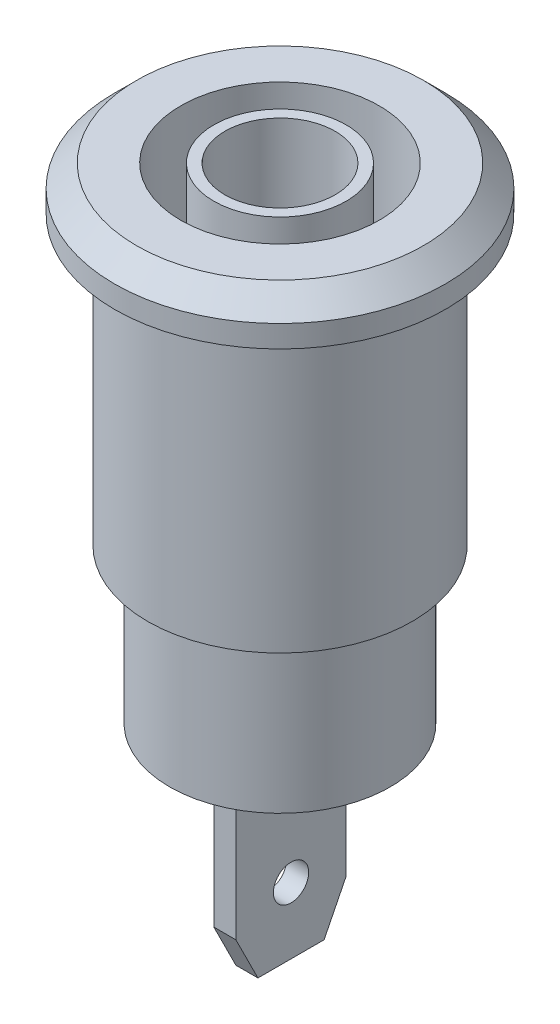
ISO-10303-21;
HEADER;
FILE_DESCRIPTION(('STEP AP214'),'2;1');
FILE_NAME('part.step','',(''),(''),'','','');
FILE_SCHEMA(('AUTOMOTIVE_DESIGN { 1 0 10303 214 1 1 1 1 }'));
ENDSEC;
DATA;
#1=APPLICATION_CONTEXT('core data for automotive mechanical design processes');
#2=APPLICATION_PROTOCOL_DEFINITION('international standard','automotive_design',2000,#1);
#3=PRODUCT_CONTEXT('',#1,'mechanical');
#4=PRODUCT('Part','Part','',(#3));
#5=PRODUCT_RELATED_PRODUCT_CATEGORY('part','',(#4));
#6=PRODUCT_DEFINITION_FORMATION('','',#4);
#7=PRODUCT_DEFINITION_CONTEXT('part definition',#1,'design');
#8=PRODUCT_DEFINITION('design','',#6,#7);
#9=PRODUCT_DEFINITION_SHAPE('','',#8);
#10=(LENGTH_UNIT() NAMED_UNIT(*) SI_UNIT(.MILLI.,.METRE.));
#11=(NAMED_UNIT(*) PLANE_ANGLE_UNIT() SI_UNIT($,.RADIAN.));
#12=(NAMED_UNIT(*) SI_UNIT($,.STERADIAN.) SOLID_ANGLE_UNIT());
#13=UNCERTAINTY_MEASURE_WITH_UNIT(LENGTH_MEASURE(1.E-05),#10,'distance_accuracy_value','');
#14=(GEOMETRIC_REPRESENTATION_CONTEXT(3) GLOBAL_UNCERTAINTY_ASSIGNED_CONTEXT((#13)) GLOBAL_UNIT_ASSIGNED_CONTEXT((#10,
#11,#12)) REPRESENTATION_CONTEXT('',''));
#15=CARTESIAN_POINT('',(0.,0.,0.));
#16=DIRECTION('',(0.,0.,1.));
#17=DIRECTION('',(1.,0.,0.));
#18=AXIS2_PLACEMENT_3D('',#15,#16,#17);
#19=CARTESIAN_POINT('',(0.,-22.,-4.99999999999998));
#20=DIRECTION('',(0.,1.,0.));
#21=DIRECTION('',(0.,0.,1.));
#22=AXIS2_PLACEMENT_3D('',#19,#20,#21);
#23=PLANE('',#22);
#24=CARTESIAN_POINT('',(0.,-22.,0.));
#25=DIRECTION('',(0.,1.,0.));
#26=DIRECTION('',(0.,0.,1.));
#27=AXIS2_PLACEMENT_3D('',#24,#25,#26);
#28=CIRCLE('',#27,5.);
#29=CARTESIAN_POINT('',(0.,-22.,5.00000000000001));
#30=VERTEX_POINT('',#29);
#31=EDGE_CURVE('E151',#30,#30,#28,.T.);
#32=ORIENTED_EDGE('',*,*,#31,.F.);
#33=EDGE_LOOP('',(#32));
#34=FACE_BOUND('',#33,.T.);
#35=DIRECTION('',(0.,0.,1.));
#36=VECTOR('',#35,1.);
#37=CARTESIAN_POINT('',(-0.500000000000056,-22.,2.5));
#38=LINE('',#37,#36);
#39=CARTESIAN_POINT('',(-0.500000000000056,-22.,-2.49999999999995));
#40=VERTEX_POINT('',#39);
#41=CARTESIAN_POINT('',(-0.500000000000056,-22.,2.5));
#42=VERTEX_POINT('',#41);
#43=EDGE_CURVE('E124',#40,#42,#38,.T.);
#44=ORIENTED_EDGE('',*,*,#43,.T.);
#45=DIRECTION('',(1.,0.,0.));
#46=VECTOR('',#45,1.);
#47=CARTESIAN_POINT('',(-0.500000000000056,-22.,2.5));
#48=LINE('',#47,#46);
#49=CARTESIAN_POINT('',(0.500000000000056,-22.,2.5));
#50=VERTEX_POINT('',#49);
#51=EDGE_CURVE('E128',#42,#50,#48,.T.);
#52=ORIENTED_EDGE('',*,*,#51,.T.);
#53=DIRECTION('',(0.,0.,1.));
#54=VECTOR('',#53,1.);
#55=CARTESIAN_POINT('',(0.500000000000056,-22.,2.5));
#56=LINE('',#55,#54);
#57=CARTESIAN_POINT('',(0.500000000000056,-22.,-2.49999999999995));
#58=VERTEX_POINT('',#57);
#59=EDGE_CURVE('E110',#58,#50,#56,.T.);
#60=ORIENTED_EDGE('',*,*,#59,.F.);
#61=DIRECTION('',(1.,0.,0.));
#62=VECTOR('',#61,1.);
#63=CARTESIAN_POINT('',(-0.500000000000056,-22.,-2.49999999999995));
#64=LINE('',#63,#62);
#65=EDGE_CURVE('E127',#40,#58,#64,.T.);
#66=ORIENTED_EDGE('',*,*,#65,.F.);
#67=EDGE_LOOP('',(#44,#52,#60,#66));
#68=FACE_BOUND('',#67,.T.);
#69=ADVANCED_FACE('F35',(#34,#68),#23,.F.);
#70=CARTESIAN_POINT('',(0.,-12.,1.11022302462516E-13));
#71=DIRECTION('',(0.,1.,0.));
#72=DIRECTION('',(0.,0.,1.));
#73=AXIS2_PLACEMENT_3D('',#70,#71,#72);
#74=PLANE('',#73);
#75=CARTESIAN_POINT('',(0.,-12.,1.11022302462516E-13));
#76=DIRECTION('',(0.,1.,0.));
#77=DIRECTION('',(0.,0.,1.));
#78=AXIS2_PLACEMENT_3D('',#75,#76,#77);
#79=CIRCLE('',#78,4.5);
#80=CARTESIAN_POINT('',(0.,-12.,4.50000000000011));
#81=VERTEX_POINT('',#80);
#82=EDGE_CURVE('E148',#81,#81,#79,.T.);
#83=ORIENTED_EDGE('',*,*,#82,.T.);
#84=EDGE_LOOP('',(#83));
#85=FACE_BOUND('',#84,.T.);
#86=CARTESIAN_POINT('',(0.,-12.,1.11022302462516E-13));
#87=DIRECTION('',(0.,1.,0.));
#88=DIRECTION('',(0.,0.,1.));
#89=AXIS2_PLACEMENT_3D('',#86,#87,#88);
#90=CIRCLE('',#89,3.);
#91=CARTESIAN_POINT('',(0.,-12.,3.00000000000011));
#92=VERTEX_POINT('',#91);
#93=EDGE_CURVE('E139',#92,#92,#90,.T.);
#94=ORIENTED_EDGE('',*,*,#93,.F.);
#95=EDGE_LOOP('',(#94));
#96=FACE_BOUND('',#95,.T.);
#97=ADVANCED_FACE('F188',(#85,#96),#74,.T.);
#98=CARTESIAN_POINT('',(0.,0.,0.));
#99=DIRECTION('',(0.,-1.,0.));
#100=DIRECTION('',(0.,0.,-1.));
#101=AXIS2_PLACEMENT_3D('',#98,#99,#100);
#102=PLANE('',#101);
#103=CARTESIAN_POINT('',(0.,0.,0.));
#104=DIRECTION('',(0.,1.,0.));
#105=DIRECTION('',(0.,0.,1.));
#106=AXIS2_PLACEMENT_3D('',#103,#104,#105);
#107=CIRCLE('',#106,4.5);
#108=CARTESIAN_POINT('',(0.,0.,4.5));
#109=VERTEX_POINT('',#108);
#110=EDGE_CURVE('E145',#109,#109,#107,.T.);
#111=ORIENTED_EDGE('',*,*,#110,.F.);
#112=EDGE_LOOP('',(#111));
#113=FACE_BOUND('',#112,.T.);
#114=CARTESIAN_POINT('',(0.,0.,0.));
#115=DIRECTION('',(0.,-1.,0.));
#116=DIRECTION('',(0.,0.,-1.));
#117=AXIS2_PLACEMENT_3D('',#114,#115,#116);
#118=CIRCLE('',#117,6.49999999999998);
#119=CARTESIAN_POINT('',(0.,0.,-6.49999999999999));
#120=VERTEX_POINT('',#119);
#121=EDGE_CURVE('E43',#120,#120,#118,.F.);
#122=ORIENTED_EDGE('',*,*,#121,.T.);
#123=EDGE_LOOP('',(#122));
#124=FACE_BOUND('',#123,.T.);
#125=ADVANCED_FACE('F37',(#113,#124),#102,.F.);
#126=CARTESIAN_POINT('',(0.,10.,0.));
#127=DIRECTION('',(0.,1.,0.));
#128=DIRECTION('',(0.,0.,1.));
#129=AXIS2_PLACEMENT_3D('',#126,#127,#128);
#130=CYLINDRICAL_SURFACE('',#129,7.5);
#131=CARTESIAN_POINT('',(0.,-1.,1.38777878078145E-13));
#132=DIRECTION('',(0.,-1.,0.));
#133=DIRECTION('',(0.,0.,-1.));
#134=AXIS2_PLACEMENT_3D('',#131,#132,#133);
#135=CIRCLE('',#134,7.5);
#136=CARTESIAN_POINT('',(0.,-1.,-7.49999999999987));
#137=VERTEX_POINT('',#136);
#138=EDGE_CURVE('E11',#137,#137,#135,.T.);
#139=ORIENTED_EDGE('',*,*,#138,.T.);
#140=EDGE_LOOP('',(#139));
#141=FACE_BOUND('',#140,.T.);
#142=CARTESIAN_POINT('',(0.,-2.,1.11022302462516E-13));
#143=DIRECTION('',(0.,1.,0.));
#144=DIRECTION('',(0.,0.,1.));
#145=AXIS2_PLACEMENT_3D('',#142,#143,#144);
#146=CIRCLE('',#145,7.5);
#147=CARTESIAN_POINT('',(0.,-2.,7.50000000000012));
#148=VERTEX_POINT('',#147);
#149=EDGE_CURVE('E163',#148,#148,#146,.T.);
#150=ORIENTED_EDGE('',*,*,#149,.T.);
#151=EDGE_LOOP('',(#150));
#152=FACE_BOUND('',#151,.T.);
#153=ADVANCED_FACE('F207',(#141,#152),#130,.T.);
#154=CARTESIAN_POINT('',(0.,-2.,-7.49999999999998));
#155=DIRECTION('',(0.,1.,0.));
#156=DIRECTION('',(0.,0.,1.));
#157=AXIS2_PLACEMENT_3D('',#154,#155,#156);
#158=PLANE('',#157);
#159=ORIENTED_EDGE('',*,*,#149,.F.);
#160=EDGE_LOOP('',(#159));
#161=FACE_BOUND('',#160,.T.);
#162=CARTESIAN_POINT('',(0.,-2.,1.11022302462516E-13));
#163=DIRECTION('',(0.,1.,0.));
#164=DIRECTION('',(0.,0.,1.));
#165=AXIS2_PLACEMENT_3D('',#162,#163,#164);
#166=CIRCLE('',#165,6.);
#167=CARTESIAN_POINT('',(0.,-2.,6.00000000000011));
#168=VERTEX_POINT('',#167);
#169=EDGE_CURVE('E160',#168,#168,#166,.T.);
#170=ORIENTED_EDGE('',*,*,#169,.T.);
#171=EDGE_LOOP('',(#170));
#172=FACE_BOUND('',#171,.T.);
#173=ADVANCED_FACE('F204',(#161,#172),#158,.F.);
#174=CARTESIAN_POINT('',(0.,10.,0.));
#175=DIRECTION('',(0.,1.,0.));
#176=DIRECTION('',(0.,0.,1.));
#177=AXIS2_PLACEMENT_3D('',#174,#175,#176);
#178=CYLINDRICAL_SURFACE('',#177,6.);
#179=ORIENTED_EDGE('',*,*,#169,.F.);
#180=EDGE_LOOP('',(#179));
#181=FACE_BOUND('',#180,.T.);
#182=CARTESIAN_POINT('',(0.,-15.,0.));
#183=DIRECTION('',(0.,1.,0.));
#184=DIRECTION('',(0.,0.,1.));
#185=AXIS2_PLACEMENT_3D('',#182,#183,#184);
#186=CIRCLE('',#185,6.);
#187=CARTESIAN_POINT('',(0.,-15.,6.));
#188=VERTEX_POINT('',#187);
#189=EDGE_CURVE('E157',#188,#188,#186,.T.);
#190=ORIENTED_EDGE('',*,*,#189,.T.);
#191=EDGE_LOOP('',(#190));
#192=FACE_BOUND('',#191,.T.);
#193=ADVANCED_FACE('F200',(#181,#192),#178,.T.);
#194=CARTESIAN_POINT('',(0.,-15.,-5.99999999999995));
#195=DIRECTION('',(0.,1.,0.));
#196=DIRECTION('',(0.,0.,1.));
#197=AXIS2_PLACEMENT_3D('',#194,#195,#196);
#198=PLANE('',#197);
#199=ORIENTED_EDGE('',*,*,#189,.F.);
#200=EDGE_LOOP('',(#199));
#201=FACE_BOUND('',#200,.T.);
#202=CARTESIAN_POINT('',(0.,-15.,0.));
#203=DIRECTION('',(0.,1.,0.));
#204=DIRECTION('',(0.,0.,1.));
#205=AXIS2_PLACEMENT_3D('',#202,#203,#204);
#206=CIRCLE('',#205,5.);
#207=CARTESIAN_POINT('',(0.,-15.,5.));
#208=VERTEX_POINT('',#207);
#209=EDGE_CURVE('E154',#208,#208,#206,.T.);
#210=ORIENTED_EDGE('',*,*,#209,.T.);
#211=EDGE_LOOP('',(#210));
#212=FACE_BOUND('',#211,.T.);
#213=ADVANCED_FACE('F182',(#201,#212),#198,.F.);
#214=CARTESIAN_POINT('',(0.,10.,0.));
#215=DIRECTION('',(0.,1.,0.));
#216=DIRECTION('',(0.,0.,1.));
#217=AXIS2_PLACEMENT_3D('',#214,#215,#216);
#218=CYLINDRICAL_SURFACE('',#217,5.);
#219=ORIENTED_EDGE('',*,*,#209,.F.);
#220=EDGE_LOOP('',(#219));
#221=FACE_BOUND('',#220,.T.);
#222=ORIENTED_EDGE('',*,*,#31,.T.);
#223=EDGE_LOOP('',(#222));
#224=FACE_BOUND('',#223,.T.);
#225=ADVANCED_FACE('F172',(#221,#224),#218,.T.);
#226=CARTESIAN_POINT('',(0.,0.,0.));
#227=DIRECTION('',(0.,-1.,0.));
#228=DIRECTION('',(0.,0.,-1.));
#229=AXIS2_PLACEMENT_3D('',#226,#227,#228);
#230=CONICAL_SURFACE('',#229,6.49999999999998,0.785398163397453);
#231=ORIENTED_EDGE('',*,*,#138,.F.);
#232=EDGE_LOOP('',(#231));
#233=FACE_BOUND('',#232,.T.);
#234=ORIENTED_EDGE('',*,*,#121,.F.);
#235=EDGE_LOOP('',(#234));
#236=FACE_BOUND('',#235,.T.);
#237=ADVANCED_FACE('F169',(#233,#236),#230,.T.);
#238=CARTESIAN_POINT('',(0.,-12.,1.11022302462516E-13));
#239=DIRECTION('',(0.,1.,0.));
#240=DIRECTION('',(0.,0.,1.));
#241=AXIS2_PLACEMENT_3D('',#238,#239,#240);
#242=CYLINDRICAL_SURFACE('',#241,4.5);
#243=ORIENTED_EDGE('',*,*,#82,.F.);
#244=EDGE_LOOP('',(#243));
#245=FACE_BOUND('',#244,.T.);
#246=ORIENTED_EDGE('',*,*,#110,.T.);
#247=EDGE_LOOP('',(#246));
#248=FACE_BOUND('',#247,.T.);
#249=ADVANCED_FACE('F171',(#245,#248),#242,.F.);
#250=CARTESIAN_POINT('',(0.,0.,0.));
#251=DIRECTION('',(0.,-1.,0.));
#252=DIRECTION('',(0.,0.,-1.));
#253=AXIS2_PLACEMENT_3D('',#250,#251,#252);
#254=CYLINDRICAL_SURFACE('',#253,3.);
#255=CARTESIAN_POINT('',(0.,0.,0.));
#256=DIRECTION('',(0.,1.,0.));
#257=DIRECTION('',(0.,0.,1.));
#258=AXIS2_PLACEMENT_3D('',#255,#256,#257);
#259=CIRCLE('',#258,3.);
#260=CARTESIAN_POINT('',(0.,0.,3.));
#261=VERTEX_POINT('',#260);
#262=EDGE_CURVE('E142',#261,#261,#259,.T.);
#263=ORIENTED_EDGE('',*,*,#262,.F.);
#264=EDGE_LOOP('',(#263));
#265=FACE_BOUND('',#264,.T.);
#266=ORIENTED_EDGE('',*,*,#93,.T.);
#267=EDGE_LOOP('',(#266));
#268=FACE_BOUND('',#267,.T.);
#269=ADVANCED_FACE('F179',(#265,#268),#254,.T.);
#270=CARTESIAN_POINT('',(0.,0.,0.));
#271=DIRECTION('',(0.,1.,0.));
#272=DIRECTION('',(0.,0.,1.));
#273=AXIS2_PLACEMENT_3D('',#270,#271,#272);
#274=PLANE('',#273);
#275=CARTESIAN_POINT('',(0.,0.,0.));
#276=DIRECTION('',(0.,1.,0.));
#277=DIRECTION('',(0.,0.,1.));
#278=AXIS2_PLACEMENT_3D('',#275,#276,#277);
#279=CIRCLE('',#278,2.5);
#280=CARTESIAN_POINT('',(0.,0.,2.5));
#281=VERTEX_POINT('',#280);
#282=EDGE_CURVE('E131',#281,#281,#279,.T.);
#283=ORIENTED_EDGE('',*,*,#282,.F.);
#284=EDGE_LOOP('',(#283));
#285=FACE_BOUND('',#284,.T.);
#286=ORIENTED_EDGE('',*,*,#262,.T.);
#287=EDGE_LOOP('',(#286));
#288=FACE_BOUND('',#287,.T.);
#289=ADVANCED_FACE('F331',(#285,#288),#274,.T.);
#290=CARTESIAN_POINT('',(0.,-12.,1.11022302462516E-13));
#291=DIRECTION('',(0.,1.,0.));
#292=DIRECTION('',(0.,0.,1.));
#293=AXIS2_PLACEMENT_3D('',#290,#291,#292);
#294=CYLINDRICAL_SURFACE('',#293,2.5);
#295=CARTESIAN_POINT('',(0.,-12.,1.11022302462516E-13));
#296=DIRECTION('',(0.,1.,0.));
#297=DIRECTION('',(0.,0.,1.));
#298=AXIS2_PLACEMENT_3D('',#295,#296,#297);
#299=CIRCLE('',#298,2.5);
#300=CARTESIAN_POINT('',(0.,-12.,2.50000000000011));
#301=VERTEX_POINT('',#300);
#302=EDGE_CURVE('E136',#301,#301,#299,.T.);
#303=ORIENTED_EDGE('',*,*,#302,.F.);
#304=EDGE_LOOP('',(#303));
#305=FACE_BOUND('',#304,.T.);
#306=ORIENTED_EDGE('',*,*,#282,.T.);
#307=EDGE_LOOP('',(#306));
#308=FACE_BOUND('',#307,.T.);
#309=ADVANCED_FACE('F242',(#305,#308),#294,.F.);
#310=CARTESIAN_POINT('',(0.,-12.,1.11022302462516E-13));
#311=DIRECTION('',(0.,1.,0.));
#312=DIRECTION('',(0.,0.,1.));
#313=AXIS2_PLACEMENT_3D('',#310,#311,#312);
#314=PLANE('',#313);
#315=ORIENTED_EDGE('',*,*,#302,.T.);
#316=EDGE_LOOP('',(#315));
#317=FACE_BOUND('',#316,.T.);
#318=ADVANCED_FACE('F237',(#317),#314,.T.);
#319=CARTESIAN_POINT('',(-0.500000000000056,-22.,2.5));
#320=DIRECTION('',(0.,0.,1.00000000000001));
#321=DIRECTION('',(0.,-1.00000000000001,0.));
#322=AXIS2_PLACEMENT_3D('',#319,#320,#321);
#323=PLANE('',#322);
#324=DIRECTION('',(1.,0.,0.));
#325=VECTOR('',#324,1.);
#326=CARTESIAN_POINT('',(-0.500000000000056,-29.,2.5));
#327=LINE('',#326,#325);
#328=CARTESIAN_POINT('',(-0.500000000000056,-29.,2.5));
#329=VERTEX_POINT('',#328);
#330=CARTESIAN_POINT('',(0.500000000000056,-29.,2.5));
#331=VERTEX_POINT('',#330);
#332=EDGE_CURVE('E112',#329,#331,#327,.T.);
#333=ORIENTED_EDGE('',*,*,#332,.T.);
#334=DIRECTION('',(0.,-1.00000000000001,0.));
#335=VECTOR('',#334,1.);
#336=CARTESIAN_POINT('',(0.500000000000056,-22.,2.5));
#337=LINE('',#336,#335);
#338=EDGE_CURVE('E108',#50,#331,#337,.T.);
#339=ORIENTED_EDGE('',*,*,#338,.F.);
#340=ORIENTED_EDGE('',*,*,#51,.F.);
#341=DIRECTION('',(0.,-1.00000000000001,0.));
#342=VECTOR('',#341,1.);
#343=CARTESIAN_POINT('',(-0.500000000000056,-22.,2.5));
#344=LINE('',#343,#342);
#345=EDGE_CURVE('E118',#42,#329,#344,.T.);
#346=ORIENTED_EDGE('',*,*,#345,.T.);
#347=EDGE_LOOP('',(#333,#339,#340,#346));
#348=FACE_BOUND('',#347,.T.);
#349=ADVANCED_FACE('F241',(#348),#323,.T.);
#350=CARTESIAN_POINT('',(-0.500000000000056,-22.,-2.49999999999995));
#351=DIRECTION('',(0.,0.,-1.00000000000001));
#352=DIRECTION('',(0.,1.00000000000001,0.));
#353=AXIS2_PLACEMENT_3D('',#350,#351,#352);
#354=PLANE('',#353);
#355=DIRECTION('',(1.,0.,0.));
#356=VECTOR('',#355,1.);
#357=CARTESIAN_POINT('',(-0.500000000000056,-29.,-2.5));
#358=LINE('',#357,#356);
#359=CARTESIAN_POINT('',(-0.500000000000056,-29.,-2.5));
#360=VERTEX_POINT('',#359);
#361=CARTESIAN_POINT('',(0.500000000000056,-29.,-2.5));
#362=VERTEX_POINT('',#361);
#363=EDGE_CURVE('E50',#360,#362,#358,.T.);
#364=ORIENTED_EDGE('',*,*,#363,.F.);
#365=DIRECTION('',(0.,1.00000000000001,0.));
#366=VECTOR('',#365,1.);
#367=CARTESIAN_POINT('',(-0.500000000000056,-22.,-2.49999999999995));
#368=LINE('',#367,#366);
#369=EDGE_CURVE('E122',#360,#40,#368,.T.);
#370=ORIENTED_EDGE('',*,*,#369,.T.);
#371=ORIENTED_EDGE('',*,*,#65,.T.);
#372=DIRECTION('',(0.,1.00000000000001,0.));
#373=VECTOR('',#372,1.);
#374=CARTESIAN_POINT('',(0.500000000000056,-22.,-2.49999999999995));
#375=LINE('',#374,#373);
#376=EDGE_CURVE('E107',#362,#58,#375,.T.);
#377=ORIENTED_EDGE('',*,*,#376,.F.);
#378=EDGE_LOOP('',(#364,#370,#371,#377));
#379=FACE_BOUND('',#378,.T.);
#380=ADVANCED_FACE('F256',(#379),#354,.T.);
#381=CARTESIAN_POINT('',(-0.500000000000056,-31.,2.50000000000011));
#382=DIRECTION('',(0.,-1.,0.));
#383=DIRECTION('',(0.,0.,-1.));
#384=AXIS2_PLACEMENT_3D('',#381,#382,#383);
#385=PLANE('',#384);
#386=DIRECTION('',(1.,0.,0.));
#387=VECTOR('',#386,1.);
#388=CARTESIAN_POINT('',(-0.500000000000056,-31.,-1.5));
#389=LINE('',#388,#387);
#390=CARTESIAN_POINT('',(-0.500000000000056,-31.,-1.5));
#391=VERTEX_POINT('',#390);
#392=CARTESIAN_POINT('',(0.500000000000056,-31.,-1.5));
#393=VERTEX_POINT('',#392);
#394=EDGE_CURVE('E88',#391,#393,#389,.T.);
#395=ORIENTED_EDGE('',*,*,#394,.T.);
#396=DIRECTION('',(0.,0.,-1.));
#397=VECTOR('',#396,1.);
#398=CARTESIAN_POINT('',(0.500000000000056,-31.,2.50000000000011));
#399=LINE('',#398,#397);
#400=CARTESIAN_POINT('',(0.500000000000056,-31.,1.50000000000008));
#401=VERTEX_POINT('',#400);
#402=EDGE_CURVE('E100',#401,#393,#399,.T.);
#403=ORIENTED_EDGE('',*,*,#402,.F.);
#404=DIRECTION('',(1.,0.,0.));
#405=VECTOR('',#404,1.);
#406=CARTESIAN_POINT('',(-0.500000000000056,-31.,1.50000000000008));
#407=LINE('',#406,#405);
#408=CARTESIAN_POINT('',(-0.500000000000056,-31.,1.50000000000008));
#409=VERTEX_POINT('',#408);
#410=EDGE_CURVE('E58',#409,#401,#407,.T.);
#411=ORIENTED_EDGE('',*,*,#410,.F.);
#412=DIRECTION('',(0.,0.,-1.));
#413=VECTOR('',#412,1.);
#414=CARTESIAN_POINT('',(-0.500000000000056,-31.,2.50000000000011));
#415=LINE('',#414,#413);
#416=EDGE_CURVE('E102',#409,#391,#415,.T.);
#417=ORIENTED_EDGE('',*,*,#416,.T.);
#418=EDGE_LOOP('',(#395,#403,#411,#417));
#419=FACE_BOUND('',#418,.T.);
#420=ADVANCED_FACE('F99',(#419),#385,.T.);
#421=CARTESIAN_POINT('',(-0.500000000000056,-31.,2.50000000000011));
#422=DIRECTION('',(1.,0.,0.));
#423=DIRECTION('',(0.,0.,-1.));
#424=AXIS2_PLACEMENT_3D('',#421,#422,#423);
#425=PLANE('',#424);
#426=CARTESIAN_POINT('',(-0.500000000000056,-28.,0.));
#427=DIRECTION('',(1.,0.,0.));
#428=DIRECTION('',(0.,0.,-1.));
#429=AXIS2_PLACEMENT_3D('',#426,#427,#428);
#430=CIRCLE('',#429,0.8);
#431=CARTESIAN_POINT('',(-0.500000000000056,-28.,-0.799999999999917));
#432=VERTEX_POINT('',#431);
#433=EDGE_CURVE('E94',#432,#432,#430,.T.);
#434=ORIENTED_EDGE('',*,*,#433,.T.);
#435=EDGE_LOOP('',(#434));
#436=FACE_BOUND('',#435,.T.);
#437=ORIENTED_EDGE('',*,*,#369,.F.);
#438=DIRECTION('',(0.,-0.894427190999915,0.447213595499959));
#439=VECTOR('',#438,1.);
#440=CARTESIAN_POINT('',(-0.500000000000056,-29.,-2.5));
#441=LINE('',#440,#439);
#442=EDGE_CURVE('E93',#360,#391,#441,.T.);
#443=ORIENTED_EDGE('',*,*,#442,.T.);
#444=ORIENTED_EDGE('',*,*,#416,.F.);
#445=DIRECTION('',(0.,0.894427190999918,0.447213595499959));
#446=VECTOR('',#445,1.);
#447=CARTESIAN_POINT('',(-0.500000000000056,-29.,2.5));
#448=LINE('',#447,#446);
#449=EDGE_CURVE('E417',#409,#329,#448,.T.);
#450=ORIENTED_EDGE('',*,*,#449,.T.);
#451=ORIENTED_EDGE('',*,*,#345,.F.);
#452=ORIENTED_EDGE('',*,*,#43,.F.);
#453=EDGE_LOOP('',(#437,#443,#444,#450,#451,#452));
#454=FACE_BOUND('',#453,.T.);
#455=ADVANCED_FACE('F271',(#436,#454),#425,.F.);
#456=CARTESIAN_POINT('',(0.500000000000056,-31.,2.50000000000011));
#457=DIRECTION('',(1.,0.,0.));
#458=DIRECTION('',(0.,0.,-1.));
#459=AXIS2_PLACEMENT_3D('',#456,#457,#458);
#460=PLANE('',#459);
#461=CARTESIAN_POINT('',(0.500000000000056,-28.,0.));
#462=DIRECTION('',(1.,0.,0.));
#463=DIRECTION('',(0.,0.,-1.));
#464=AXIS2_PLACEMENT_3D('',#461,#462,#463);
#465=CIRCLE('',#464,0.8);
#466=CARTESIAN_POINT('',(0.500000000000056,-28.,-0.799999999999917));
#467=VERTEX_POINT('',#466);
#468=EDGE_CURVE('E410',#467,#467,#465,.T.);
#469=ORIENTED_EDGE('',*,*,#468,.F.);
#470=EDGE_LOOP('',(#469));
#471=FACE_BOUND('',#470,.T.);
#472=DIRECTION('',(0.,-0.894427190999915,0.447213595499959));
#473=VECTOR('',#472,1.);
#474=CARTESIAN_POINT('',(0.500000000000056,-29.,-2.5));
#475=LINE('',#474,#473);
#476=EDGE_CURVE('E85',#362,#393,#475,.T.);
#477=ORIENTED_EDGE('',*,*,#476,.F.);
#478=ORIENTED_EDGE('',*,*,#376,.T.);
#479=ORIENTED_EDGE('',*,*,#59,.T.);
#480=ORIENTED_EDGE('',*,*,#338,.T.);
#481=DIRECTION('',(0.,0.894427190999918,0.447213595499959));
#482=VECTOR('',#481,1.);
#483=CARTESIAN_POINT('',(0.500000000000056,-29.,2.5));
#484=LINE('',#483,#482);
#485=EDGE_CURVE('E103',#401,#331,#484,.T.);
#486=ORIENTED_EDGE('',*,*,#485,.F.);
#487=ORIENTED_EDGE('',*,*,#402,.T.);
#488=EDGE_LOOP('',(#477,#478,#479,#480,#486,#487));
#489=FACE_BOUND('',#488,.T.);
#490=ADVANCED_FACE('F105',(#471,#489),#460,.T.);
#491=CARTESIAN_POINT('',(-0.500000000000056,-29.,2.5));
#492=DIRECTION('',(0.,0.447213595499959,-0.894427190999918));
#493=DIRECTION('',(0.,0.894427190999918,0.447213595499959));
#494=AXIS2_PLACEMENT_3D('',#491,#492,#493);
#495=PLANE('',#494);
#496=ORIENTED_EDGE('',*,*,#485,.T.);
#497=ORIENTED_EDGE('',*,*,#332,.F.);
#498=ORIENTED_EDGE('',*,*,#449,.F.);
#499=ORIENTED_EDGE('',*,*,#410,.T.);
#500=EDGE_LOOP('',(#496,#497,#498,#499));
#501=FACE_BOUND('',#500,.T.);
#502=ADVANCED_FACE('F285',(#501),#495,.F.);
#503=CARTESIAN_POINT('',(-0.500000000000056,-29.,-2.5));
#504=DIRECTION('',(0.,0.44721359549996,0.894427190999918));
#505=DIRECTION('',(0.,-0.894427190999918,0.44721359549996));
#506=AXIS2_PLACEMENT_3D('',#503,#504,#505);
#507=PLANE('',#506);
#508=ORIENTED_EDGE('',*,*,#476,.T.);
#509=ORIENTED_EDGE('',*,*,#394,.F.);
#510=ORIENTED_EDGE('',*,*,#442,.F.);
#511=ORIENTED_EDGE('',*,*,#363,.T.);
#512=EDGE_LOOP('',(#508,#509,#510,#511));
#513=FACE_BOUND('',#512,.T.);
#514=ADVANCED_FACE('F87',(#513),#507,.F.);
#515=CARTESIAN_POINT('',(-0.500000000000056,-28.,0.));
#516=DIRECTION('',(1.,0.,0.));
#517=DIRECTION('',(0.,0.,-1.));
#518=AXIS2_PLACEMENT_3D('',#515,#516,#517);
#519=CYLINDRICAL_SURFACE('',#518,0.8);
#520=ORIENTED_EDGE('',*,*,#433,.F.);
#521=EDGE_LOOP('',(#520));
#522=FACE_BOUND('',#521,.T.);
#523=ORIENTED_EDGE('',*,*,#468,.T.);
#524=EDGE_LOOP('',(#523));
#525=FACE_BOUND('',#524,.T.);
#526=ADVANCED_FACE('F299',(#522,#525),#519,.F.);
#527=CLOSED_SHELL('',(#69,#97,#125,#153,#173,#193,#213,#225,#237,#249,#269,#289,#309,#318,#349,
#380,#420,#455,#490,#502,#514,#526));
#528=MANIFOLD_SOLID_BREP('B2',#527);
#529=ADVANCED_BREP_SHAPE_REPRESENTATION('',(#18,#528),#14);
#530=SHAPE_DEFINITION_REPRESENTATION(#9,#529);
ENDSEC;
END-ISO-10303-21;
